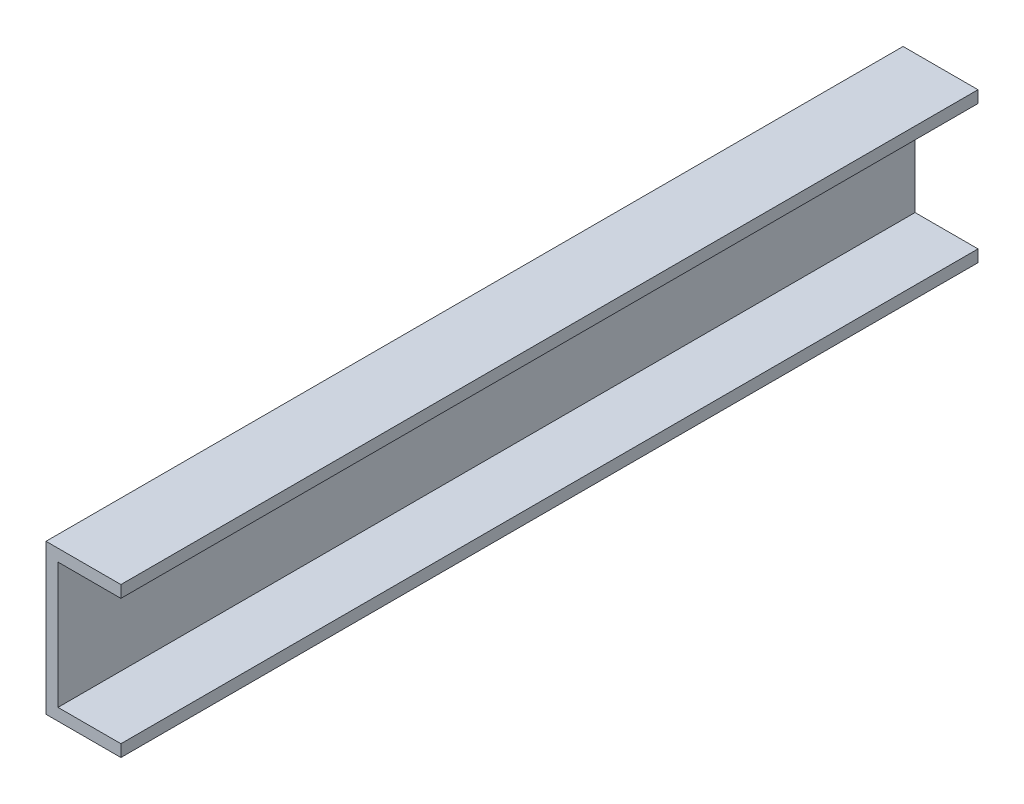
ISO-10303-21;
HEADER;
FILE_DESCRIPTION(('STEP AP214'),'2;1');
FILE_NAME('part.step','',(''),(''),'','','');
FILE_SCHEMA(('AUTOMOTIVE_DESIGN { 1 0 10303 214 1 1 1 1 }'));
ENDSEC;
DATA;
#1=APPLICATION_CONTEXT('core data for automotive mechanical design processes');
#2=APPLICATION_PROTOCOL_DEFINITION('international standard','automotive_design',2000,#1);
#3=PRODUCT_CONTEXT('',#1,'mechanical');
#4=PRODUCT('Part','Part','',(#3));
#5=PRODUCT_RELATED_PRODUCT_CATEGORY('part','',(#4));
#6=PRODUCT_DEFINITION_FORMATION('','',#4);
#7=PRODUCT_DEFINITION_CONTEXT('part definition',#1,'design');
#8=PRODUCT_DEFINITION('design','',#6,#7);
#9=PRODUCT_DEFINITION_SHAPE('','',#8);
#10=(LENGTH_UNIT() NAMED_UNIT(*) SI_UNIT(.MILLI.,.METRE.));
#11=(NAMED_UNIT(*) PLANE_ANGLE_UNIT() SI_UNIT($,.RADIAN.));
#12=(NAMED_UNIT(*) SI_UNIT($,.STERADIAN.) SOLID_ANGLE_UNIT());
#13=UNCERTAINTY_MEASURE_WITH_UNIT(LENGTH_MEASURE(1.E-05),#10,'distance_accuracy_value','');
#14=(GEOMETRIC_REPRESENTATION_CONTEXT(3) GLOBAL_UNCERTAINTY_ASSIGNED_CONTEXT((#13)) GLOBAL_UNIT_ASSIGNED_CONTEXT((#10,
#11,#12)) REPRESENTATION_CONTEXT('',''));
#15=CARTESIAN_POINT('',(0.,0.,0.));
#16=DIRECTION('',(0.,0.,1.));
#17=DIRECTION('',(1.,0.,0.));
#18=AXIS2_PLACEMENT_3D('',#15,#16,#17);
#19=CARTESIAN_POINT('',(0.,0.,572.));
#20=DIRECTION('',(0.,-1.,0.));
#21=DIRECTION('',(0.,0.,-1.));
#22=AXIS2_PLACEMENT_3D('',#19,#20,#21);
#23=PLANE('',#22);
#24=DIRECTION('',(-1.,0.,0.));
#25=VECTOR('',#24,1.);
#26=CARTESIAN_POINT('',(0.,0.,0.));
#27=LINE('',#26,#25);
#28=CARTESIAN_POINT('',(50.,0.,0.));
#29=VERTEX_POINT('',#28);
#30=CARTESIAN_POINT('',(0.,0.,0.));
#31=VERTEX_POINT('',#30);
#32=EDGE_CURVE('E129',#29,#31,#27,.T.);
#33=ORIENTED_EDGE('',*,*,#32,.T.);
#34=DIRECTION('',(0.,0.,-1.));
#35=VECTOR('',#34,1.);
#36=CARTESIAN_POINT('',(0.,0.,572.));
#37=LINE('',#36,#35);
#38=CARTESIAN_POINT('',(0.,0.,572.));
#39=VERTEX_POINT('',#38);
#40=EDGE_CURVE('E11',#39,#31,#37,.T.);
#41=ORIENTED_EDGE('',*,*,#40,.F.);
#42=DIRECTION('',(-1.,0.,0.));
#43=VECTOR('',#42,1.);
#44=CARTESIAN_POINT('',(0.,0.,572.));
#45=LINE('',#44,#43);
#46=CARTESIAN_POINT('',(50.,0.,572.));
#47=VERTEX_POINT('',#46);
#48=EDGE_CURVE('E143',#47,#39,#45,.T.);
#49=ORIENTED_EDGE('',*,*,#48,.F.);
#50=DIRECTION('',(0.,0.,-1.));
#51=VECTOR('',#50,1.);
#52=CARTESIAN_POINT('',(50.,0.,572.));
#53=LINE('',#52,#51);
#54=EDGE_CURVE('E125',#47,#29,#53,.T.);
#55=ORIENTED_EDGE('',*,*,#54,.T.);
#56=EDGE_LOOP('',(#33,#41,#49,#55));
#57=FACE_BOUND('',#56,.T.);
#58=ADVANCED_FACE('F33',(#57),#23,.F.);
#59=CARTESIAN_POINT('',(0.,0.,572.));
#60=DIRECTION('',(1.,0.,0.));
#61=DIRECTION('',(0.,0.,-1.));
#62=AXIS2_PLACEMENT_3D('',#59,#60,#61);
#63=PLANE('',#62);
#64=DIRECTION('',(0.,-1.,0.));
#65=VECTOR('',#64,1.);
#66=CARTESIAN_POINT('',(0.,0.,0.));
#67=LINE('',#66,#65);
#68=CARTESIAN_POINT('',(0.,-100.,0.));
#69=VERTEX_POINT('',#68);
#70=EDGE_CURVE('E132',#31,#69,#67,.T.);
#71=ORIENTED_EDGE('',*,*,#70,.T.);
#72=DIRECTION('',(0.,0.,-1.));
#73=VECTOR('',#72,1.);
#74=CARTESIAN_POINT('',(0.,-100.,572.));
#75=LINE('',#74,#73);
#76=CARTESIAN_POINT('',(0.,-100.,572.));
#77=VERTEX_POINT('',#76);
#78=EDGE_CURVE('E41',#77,#69,#75,.T.);
#79=ORIENTED_EDGE('',*,*,#78,.F.);
#80=DIRECTION('',(0.,-1.,0.));
#81=VECTOR('',#80,1.);
#82=CARTESIAN_POINT('',(0.,0.,572.));
#83=LINE('',#82,#81);
#84=EDGE_CURVE('E92',#39,#77,#83,.T.);
#85=ORIENTED_EDGE('',*,*,#84,.F.);
#86=ORIENTED_EDGE('',*,*,#40,.T.);
#87=EDGE_LOOP('',(#71,#79,#85,#86));
#88=FACE_BOUND('',#87,.T.);
#89=ADVANCED_FACE('F178',(#88),#63,.F.);
#90=CARTESIAN_POINT('',(0.,-100.,572.));
#91=DIRECTION('',(0.,1.,0.));
#92=DIRECTION('',(0.,0.,1.));
#93=AXIS2_PLACEMENT_3D('',#90,#91,#92);
#94=PLANE('',#93);
#95=DIRECTION('',(1.,0.,0.));
#96=VECTOR('',#95,1.);
#97=CARTESIAN_POINT('',(0.,-100.,0.));
#98=LINE('',#97,#96);
#99=CARTESIAN_POINT('',(50.,-100.,0.));
#100=VERTEX_POINT('',#99);
#101=EDGE_CURVE('E134',#69,#100,#98,.T.);
#102=ORIENTED_EDGE('',*,*,#101,.T.);
#103=DIRECTION('',(0.,0.,-1.));
#104=VECTOR('',#103,1.);
#105=CARTESIAN_POINT('',(50.,-100.,572.));
#106=LINE('',#105,#104);
#107=CARTESIAN_POINT('',(50.,-100.,572.));
#108=VERTEX_POINT('',#107);
#109=EDGE_CURVE('E150',#108,#100,#106,.T.);
#110=ORIENTED_EDGE('',*,*,#109,.F.);
#111=DIRECTION('',(1.,0.,0.));
#112=VECTOR('',#111,1.);
#113=CARTESIAN_POINT('',(0.,-100.,572.));
#114=LINE('',#113,#112);
#115=EDGE_CURVE('E158',#77,#108,#114,.T.);
#116=ORIENTED_EDGE('',*,*,#115,.F.);
#117=ORIENTED_EDGE('',*,*,#78,.T.);
#118=EDGE_LOOP('',(#102,#110,#116,#117));
#119=FACE_BOUND('',#118,.T.);
#120=ADVANCED_FACE('F156',(#119),#94,.F.);
#121=CARTESIAN_POINT('',(50.,-100.,572.));
#122=DIRECTION('',(-1.,0.,0.));
#123=DIRECTION('',(0.,0.,1.));
#124=AXIS2_PLACEMENT_3D('',#121,#122,#123);
#125=PLANE('',#124);
#126=DIRECTION('',(0.,1.,0.));
#127=VECTOR('',#126,1.);
#128=CARTESIAN_POINT('',(50.,-100.,0.));
#129=LINE('',#128,#127);
#130=CARTESIAN_POINT('',(50.,-92.,0.));
#131=VERTEX_POINT('',#130);
#132=EDGE_CURVE('E136',#100,#131,#129,.T.);
#133=ORIENTED_EDGE('',*,*,#132,.T.);
#134=DIRECTION('',(0.,0.,-1.));
#135=VECTOR('',#134,1.);
#136=CARTESIAN_POINT('',(50.,-92.,572.));
#137=LINE('',#136,#135);
#138=CARTESIAN_POINT('',(50.,-92.,572.));
#139=VERTEX_POINT('',#138);
#140=EDGE_CURVE('E147',#139,#131,#137,.T.);
#141=ORIENTED_EDGE('',*,*,#140,.F.);
#142=DIRECTION('',(0.,1.,0.));
#143=VECTOR('',#142,1.);
#144=CARTESIAN_POINT('',(50.,-100.,572.));
#145=LINE('',#144,#143);
#146=EDGE_CURVE('E170',#108,#139,#145,.T.);
#147=ORIENTED_EDGE('',*,*,#146,.F.);
#148=ORIENTED_EDGE('',*,*,#109,.T.);
#149=EDGE_LOOP('',(#133,#141,#147,#148));
#150=FACE_BOUND('',#149,.T.);
#151=ADVANCED_FACE('F166',(#150),#125,.F.);
#152=CARTESIAN_POINT('',(50.,-92.,572.));
#153=DIRECTION('',(0.,-1.,0.));
#154=DIRECTION('',(0.,0.,-1.));
#155=AXIS2_PLACEMENT_3D('',#152,#153,#154);
#156=PLANE('',#155);
#157=DIRECTION('',(-1.,0.,0.));
#158=VECTOR('',#157,1.);
#159=CARTESIAN_POINT('',(50.,-92.,0.));
#160=LINE('',#159,#158);
#161=CARTESIAN_POINT('',(8.00000000000001,-92.,0.));
#162=VERTEX_POINT('',#161);
#163=EDGE_CURVE('E138',#131,#162,#160,.T.);
#164=ORIENTED_EDGE('',*,*,#163,.T.);
#165=DIRECTION('',(0.,0.,-1.));
#166=VECTOR('',#165,1.);
#167=CARTESIAN_POINT('',(8.00000000000001,-92.,572.));
#168=LINE('',#167,#166);
#169=CARTESIAN_POINT('',(8.00000000000001,-92.,572.));
#170=VERTEX_POINT('',#169);
#171=EDGE_CURVE('E120',#170,#162,#168,.T.);
#172=ORIENTED_EDGE('',*,*,#171,.F.);
#173=DIRECTION('',(-1.,0.,0.));
#174=VECTOR('',#173,1.);
#175=CARTESIAN_POINT('',(50.,-92.,572.));
#176=LINE('',#175,#174);
#177=EDGE_CURVE('E111',#139,#170,#176,.T.);
#178=ORIENTED_EDGE('',*,*,#177,.F.);
#179=ORIENTED_EDGE('',*,*,#140,.T.);
#180=EDGE_LOOP('',(#164,#172,#178,#179));
#181=FACE_BOUND('',#180,.T.);
#182=ADVANCED_FACE('F169',(#181),#156,.F.);
#183=CARTESIAN_POINT('',(8.00000000000001,-92.,572.));
#184=DIRECTION('',(-1.,0.,0.));
#185=DIRECTION('',(0.,-1.,0.));
#186=AXIS2_PLACEMENT_3D('',#183,#184,#185);
#187=PLANE('',#186);
#188=DIRECTION('',(0.,1.,0.));
#189=VECTOR('',#188,1.);
#190=CARTESIAN_POINT('',(8.00000000000001,-92.,0.));
#191=LINE('',#190,#189);
#192=CARTESIAN_POINT('',(8.00000000000001,-8.00000000000001,0.));
#193=VERTEX_POINT('',#192);
#194=EDGE_CURVE('E119',#162,#193,#191,.T.);
#195=ORIENTED_EDGE('',*,*,#194,.T.);
#196=DIRECTION('',(0.,0.,-1.));
#197=VECTOR('',#196,1.);
#198=CARTESIAN_POINT('',(8.00000000000001,-8.00000000000001,572.));
#199=LINE('',#198,#197);
#200=CARTESIAN_POINT('',(8.00000000000001,-8.00000000000001,572.));
#201=VERTEX_POINT('',#200);
#202=EDGE_CURVE('E116',#201,#193,#199,.T.);
#203=ORIENTED_EDGE('',*,*,#202,.F.);
#204=DIRECTION('',(0.,1.,0.));
#205=VECTOR('',#204,1.);
#206=CARTESIAN_POINT('',(8.00000000000001,-92.,572.));
#207=LINE('',#206,#205);
#208=EDGE_CURVE('E105',#170,#201,#207,.T.);
#209=ORIENTED_EDGE('',*,*,#208,.F.);
#210=ORIENTED_EDGE('',*,*,#171,.T.);
#211=EDGE_LOOP('',(#195,#203,#209,#210));
#212=FACE_BOUND('',#211,.T.);
#213=ADVANCED_FACE('F117',(#212),#187,.F.);
#214=CARTESIAN_POINT('',(50.,-8.00000000000001,572.));
#215=DIRECTION('',(0.,1.,0.));
#216=DIRECTION('',(0.,0.,1.));
#217=AXIS2_PLACEMENT_3D('',#214,#215,#216);
#218=PLANE('',#217);
#219=DIRECTION('',(1.,0.,0.));
#220=VECTOR('',#219,1.);
#221=CARTESIAN_POINT('',(50.,-8.00000000000001,0.));
#222=LINE('',#221,#220);
#223=CARTESIAN_POINT('',(50.,-8.00000000000001,0.));
#224=VERTEX_POINT('',#223);
#225=EDGE_CURVE('E78',#193,#224,#222,.T.);
#226=ORIENTED_EDGE('',*,*,#225,.T.);
#227=DIRECTION('',(0.,0.,-1.));
#228=VECTOR('',#227,1.);
#229=CARTESIAN_POINT('',(50.,-8.00000000000001,572.));
#230=LINE('',#229,#228);
#231=CARTESIAN_POINT('',(50.,-8.00000000000001,572.));
#232=VERTEX_POINT('',#231);
#233=EDGE_CURVE('E121',#232,#224,#230,.T.);
#234=ORIENTED_EDGE('',*,*,#233,.F.);
#235=DIRECTION('',(1.,0.,0.));
#236=VECTOR('',#235,1.);
#237=CARTESIAN_POINT('',(50.,-8.00000000000001,572.));
#238=LINE('',#237,#236);
#239=EDGE_CURVE('E109',#201,#232,#238,.T.);
#240=ORIENTED_EDGE('',*,*,#239,.F.);
#241=ORIENTED_EDGE('',*,*,#202,.T.);
#242=EDGE_LOOP('',(#226,#234,#240,#241));
#243=FACE_BOUND('',#242,.T.);
#244=ADVANCED_FACE('F123',(#243),#218,.F.);
#245=CARTESIAN_POINT('',(50.,0.,572.));
#246=DIRECTION('',(-1.,0.,0.));
#247=DIRECTION('',(0.,0.,1.));
#248=AXIS2_PLACEMENT_3D('',#245,#246,#247);
#249=PLANE('',#248);
#250=DIRECTION('',(0.,1.,0.));
#251=VECTOR('',#250,1.);
#252=CARTESIAN_POINT('',(50.,0.,0.));
#253=LINE('',#252,#251);
#254=EDGE_CURVE('E84',#224,#29,#253,.T.);
#255=ORIENTED_EDGE('',*,*,#254,.T.);
#256=ORIENTED_EDGE('',*,*,#54,.F.);
#257=DIRECTION('',(0.,1.,0.));
#258=VECTOR('',#257,1.);
#259=CARTESIAN_POINT('',(50.,0.,572.));
#260=LINE('',#259,#258);
#261=EDGE_CURVE('E49',#232,#47,#260,.T.);
#262=ORIENTED_EDGE('',*,*,#261,.F.);
#263=ORIENTED_EDGE('',*,*,#233,.T.);
#264=EDGE_LOOP('',(#255,#256,#262,#263));
#265=FACE_BOUND('',#264,.T.);
#266=ADVANCED_FACE('F194',(#265),#249,.F.);
#267=CARTESIAN_POINT('',(0.,0.,572.));
#268=DIRECTION('',(0.,0.,-1.));
#269=DIRECTION('',(-1.,0.,0.));
#270=AXIS2_PLACEMENT_3D('',#267,#268,#269);
#271=PLANE('',#270);
#272=ORIENTED_EDGE('',*,*,#48,.T.);
#273=ORIENTED_EDGE('',*,*,#84,.T.);
#274=ORIENTED_EDGE('',*,*,#115,.T.);
#275=ORIENTED_EDGE('',*,*,#146,.T.);
#276=ORIENTED_EDGE('',*,*,#177,.T.);
#277=ORIENTED_EDGE('',*,*,#208,.T.);
#278=ORIENTED_EDGE('',*,*,#239,.T.);
#279=ORIENTED_EDGE('',*,*,#261,.T.);
#280=EDGE_LOOP('',(#272,#273,#274,#275,#276,#277,#278,#279));
#281=FACE_BOUND('',#280,.T.);
#282=ADVANCED_FACE('F107',(#281),#271,.F.);
#283=CARTESIAN_POINT('',(0.,0.,0.));
#284=DIRECTION('',(0.,0.,-1.));
#285=DIRECTION('',(-1.,0.,0.));
#286=AXIS2_PLACEMENT_3D('',#283,#284,#285);
#287=PLANE('',#286);
#288=ORIENTED_EDGE('',*,*,#32,.F.);
#289=ORIENTED_EDGE('',*,*,#254,.F.);
#290=ORIENTED_EDGE('',*,*,#225,.F.);
#291=ORIENTED_EDGE('',*,*,#194,.F.);
#292=ORIENTED_EDGE('',*,*,#163,.F.);
#293=ORIENTED_EDGE('',*,*,#132,.F.);
#294=ORIENTED_EDGE('',*,*,#101,.F.);
#295=ORIENTED_EDGE('',*,*,#70,.F.);
#296=EDGE_LOOP('',(#288,#289,#290,#291,#292,#293,#294,#295));
#297=FACE_BOUND('',#296,.T.);
#298=ADVANCED_FACE('F162',(#297),#287,.T.);
#299=CLOSED_SHELL('',(#58,#89,#120,#151,#182,#213,#244,#266,#282,#298));
#300=MANIFOLD_SOLID_BREP('B2',#299);
#301=ADVANCED_BREP_SHAPE_REPRESENTATION('',(#18,#300),#14);
#302=SHAPE_DEFINITION_REPRESENTATION(#9,#301);
ENDSEC;
END-ISO-10303-21;
